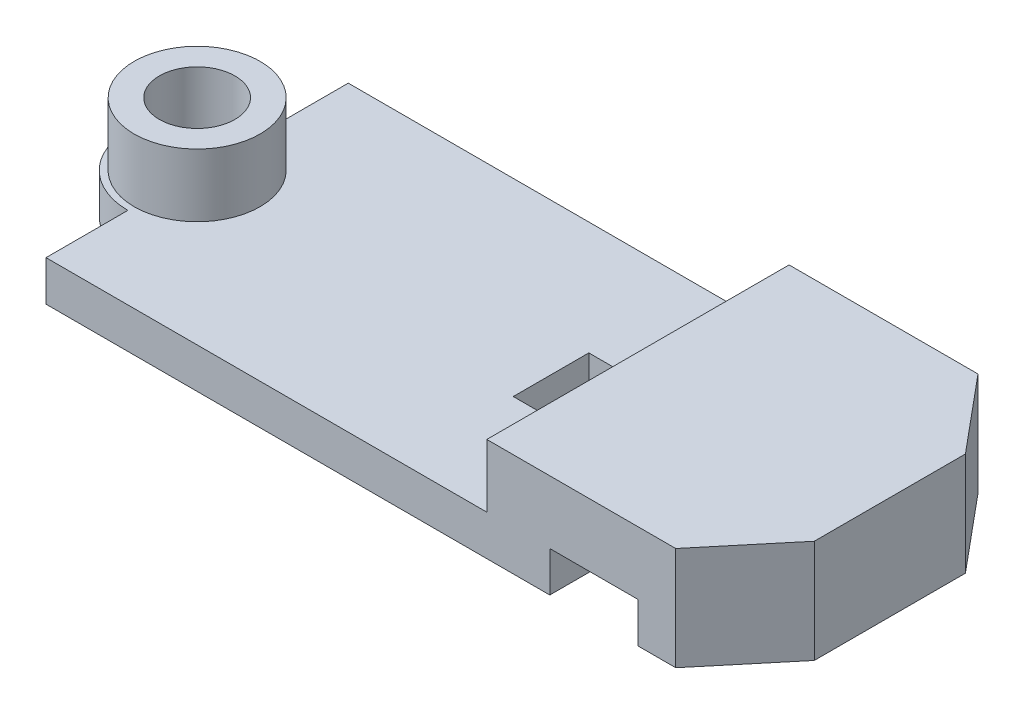
ISO-10303-21;
HEADER;
FILE_DESCRIPTION(('STEP AP214'),'2;1');
FILE_NAME('part.step','',(''),(''),'','','');
FILE_SCHEMA(('AUTOMOTIVE_DESIGN { 1 0 10303 214 1 1 1 1 }'));
ENDSEC;
DATA;
#1=APPLICATION_CONTEXT('core data for automotive mechanical design processes');
#2=APPLICATION_PROTOCOL_DEFINITION('international standard','automotive_design',2000,#1);
#3=PRODUCT_CONTEXT('',#1,'mechanical');
#4=PRODUCT('Part','Part','',(#3));
#5=PRODUCT_RELATED_PRODUCT_CATEGORY('part','',(#4));
#6=PRODUCT_DEFINITION_FORMATION('','',#4);
#7=PRODUCT_DEFINITION_CONTEXT('part definition',#1,'design');
#8=PRODUCT_DEFINITION('design','',#6,#7);
#9=PRODUCT_DEFINITION_SHAPE('','',#8);
#10=(LENGTH_UNIT() NAMED_UNIT(*) SI_UNIT(.MILLI.,.METRE.));
#11=(NAMED_UNIT(*) PLANE_ANGLE_UNIT() SI_UNIT($,.RADIAN.));
#12=(NAMED_UNIT(*) SI_UNIT($,.STERADIAN.) SOLID_ANGLE_UNIT());
#13=UNCERTAINTY_MEASURE_WITH_UNIT(LENGTH_MEASURE(1.E-05),#10,'distance_accuracy_value','');
#14=(GEOMETRIC_REPRESENTATION_CONTEXT(3) GLOBAL_UNCERTAINTY_ASSIGNED_CONTEXT((#13)) GLOBAL_UNIT_ASSIGNED_CONTEXT((#10,
#11,#12)) REPRESENTATION_CONTEXT('',''));
#15=CARTESIAN_POINT('',(0.,0.,0.));
#16=DIRECTION('',(0.,0.,1.));
#17=DIRECTION('',(1.,0.,0.));
#18=AXIS2_PLACEMENT_3D('',#15,#16,#17);
#19=CARTESIAN_POINT('',(0.,0.,0.));
#20=DIRECTION('',(0.,1.,0.));
#21=DIRECTION('',(0.,0.,1.));
#22=AXIS2_PLACEMENT_3D('',#19,#20,#21);
#23=PLANE('',#22);
#24=DIRECTION('',(1.,0.,0.));
#25=VECTOR('',#24,1.);
#26=CARTESIAN_POINT('',(53.,0.,-15.));
#27=LINE('',#26,#25);
#28=CARTESIAN_POINT('',(53.,0.,-15.));
#29=VERTEX_POINT('',#28);
#30=CARTESIAN_POINT('',(78.,0.,-15.));
#31=VERTEX_POINT('',#30);
#32=EDGE_CURVE('E249',#29,#31,#27,.T.);
#33=ORIENTED_EDGE('',*,*,#32,.F.);
#34=DIRECTION('',(0.,0.,1.));
#35=VECTOR('',#34,1.);
#36=CARTESIAN_POINT('',(53.,0.,-15.));
#37=LINE('',#36,#35);
#38=CARTESIAN_POINT('',(53.,0.,15.));
#39=VERTEX_POINT('',#38);
#40=EDGE_CURVE('E240',#29,#39,#37,.T.);
#41=ORIENTED_EDGE('',*,*,#40,.T.);
#42=DIRECTION('',(1.,0.,0.));
#43=VECTOR('',#42,1.);
#44=CARTESIAN_POINT('',(53.,0.,15.));
#45=LINE('',#44,#43);
#46=CARTESIAN_POINT('',(78.,0.,15.));
#47=VERTEX_POINT('',#46);
#48=EDGE_CURVE('E243',#39,#47,#45,.T.);
#49=ORIENTED_EDGE('',*,*,#48,.T.);
#50=DIRECTION('',(0.,0.,1.));
#51=VECTOR('',#50,1.);
#52=CARTESIAN_POINT('',(78.,0.,-15.));
#53=LINE('',#52,#51);
#54=EDGE_CURVE('E247',#31,#47,#53,.T.);
#55=ORIENTED_EDGE('',*,*,#54,.F.);
#56=EDGE_LOOP('',(#33,#41,#49,#55));
#57=FACE_BOUND('',#56,.T.);
#58=CARTESIAN_POINT('',(-87.5,0.,0.));
#59=DIRECTION('',(0.,-1.,0.));
#60=DIRECTION('',(0.,0.,-1.));
#61=AXIS2_PLACEMENT_3D('',#58,#59,#60);
#62=CIRCLE('',#61,30.);
#63=CARTESIAN_POINT('',(-87.5,0.,-30.));
#64=VERTEX_POINT('',#63);
#65=CARTESIAN_POINT('',(-87.5,0.,30.));
#66=VERTEX_POINT('',#65);
#67=EDGE_CURVE('E209',#64,#66,#62,.T.);
#68=ORIENTED_EDGE('',*,*,#67,.F.);
#69=DIRECTION('',(0.,0.,1.));
#70=VECTOR('',#69,1.);
#71=CARTESIAN_POINT('',(-87.5,0.,-60.));
#72=LINE('',#71,#70);
#73=CARTESIAN_POINT('',(-87.5,0.,-60.));
#74=VERTEX_POINT('',#73);
#75=EDGE_CURVE('E351',#74,#64,#72,.T.);
#76=ORIENTED_EDGE('',*,*,#75,.F.);
#77=DIRECTION('',(-1.,0.,0.));
#78=VECTOR('',#77,1.);
#79=CARTESIAN_POINT('',(-87.5,0.,-60.));
#80=LINE('',#79,#78);
#81=CARTESIAN_POINT('',(112.5,0.,-60.));
#82=VERTEX_POINT('',#81);
#83=EDGE_CURVE('E322',#82,#74,#80,.T.);
#84=ORIENTED_EDGE('',*,*,#83,.F.);
#85=DIRECTION('',(0.,0.,1.));
#86=VECTOR('',#85,1.);
#87=CARTESIAN_POINT('',(112.5,0.,-60.));
#88=LINE('',#87,#86);
#89=CARTESIAN_POINT('',(112.5,0.,60.));
#90=VERTEX_POINT('',#89);
#91=EDGE_CURVE('E289',#82,#90,#88,.T.);
#92=ORIENTED_EDGE('',*,*,#91,.T.);
#93=DIRECTION('',(1.,0.,0.));
#94=VECTOR('',#93,1.);
#95=CARTESIAN_POINT('',(-87.5,0.,60.));
#96=LINE('',#95,#94);
#97=CARTESIAN_POINT('',(-87.5,0.,60.));
#98=VERTEX_POINT('',#97);
#99=EDGE_CURVE('E338',#98,#90,#96,.T.);
#100=ORIENTED_EDGE('',*,*,#99,.F.);
#101=EDGE_CURVE('E350',#66,#98,#72,.T.);
#102=ORIENTED_EDGE('',*,*,#101,.F.);
#103=EDGE_LOOP('',(#68,#76,#84,#92,#100,#102));
#104=FACE_BOUND('',#103,.T.);
#105=ADVANCED_FACE('F36',(#57,#104),#23,.F.);
#106=DIRECTION('',(0.,0.,-1.));
#107=VECTOR('',#106,1.);
#108=CARTESIAN_POINT('',(-87.5,0.,30.));
#109=LINE('',#108,#107);
#110=CARTESIAN_POINT('',(-87.5,0.,27.5));
#111=VERTEX_POINT('',#110);
#112=CARTESIAN_POINT('',(-87.5,0.,25.));
#113=VERTEX_POINT('',#112);
#114=EDGE_CURVE('E205',#111,#113,#109,.T.);
#115=ORIENTED_EDGE('',*,*,#114,.F.);
#116=CARTESIAN_POINT('',(-87.5,0.,0.));
#117=DIRECTION('',(0.,-1.,0.));
#118=DIRECTION('',(0.,0.,-1.));
#119=AXIS2_PLACEMENT_3D('',#116,#117,#118);
#120=CIRCLE('',#119,27.5);
#121=CARTESIAN_POINT('',(-87.5,0.,-27.5));
#122=VERTEX_POINT('',#121);
#123=EDGE_CURVE('E223',#111,#122,#120,.T.);
#124=ORIENTED_EDGE('',*,*,#123,.T.);
#125=CARTESIAN_POINT('',(-87.5,0.,-25.));
#126=VERTEX_POINT('',#125);
#127=EDGE_CURVE('E408',#126,#122,#109,.T.);
#128=ORIENTED_EDGE('',*,*,#127,.F.);
#129=CARTESIAN_POINT('',(-87.5,0.,0.));
#130=DIRECTION('',(0.,-1.,0.));
#131=DIRECTION('',(0.,0.,-1.));
#132=AXIS2_PLACEMENT_3D('',#129,#130,#131);
#133=CIRCLE('',#132,25.);
#134=EDGE_CURVE('E211',#113,#126,#133,.T.);
#135=ORIENTED_EDGE('',*,*,#134,.F.);
#136=EDGE_LOOP('',(#115,#124,#128,#135));
#137=FACE_BOUND('',#136,.T.);
#138=ADVANCED_FACE('F407',(#137),#23,.F.);
#139=CARTESIAN_POINT('',(-87.5,16.,-60.));
#140=DIRECTION('',(1.,0.,0.));
#141=DIRECTION('',(0.,0.,-1.));
#142=AXIS2_PLACEMENT_3D('',#139,#140,#141);
#143=PLANE('',#142);
#144=DIRECTION('',(0.,0.,1.));
#145=VECTOR('',#144,1.);
#146=CARTESIAN_POINT('',(-87.5,16.,-60.));
#147=LINE('',#146,#145);
#148=CARTESIAN_POINT('',(-87.5,16.,27.5));
#149=VERTEX_POINT('',#148);
#150=CARTESIAN_POINT('',(-87.5,16.,60.));
#151=VERTEX_POINT('',#150);
#152=EDGE_CURVE('E340',#149,#151,#147,.T.);
#153=ORIENTED_EDGE('',*,*,#152,.F.);
#154=DIRECTION('',(0.,-1.,0.));
#155=VECTOR('',#154,1.);
#156=CARTESIAN_POINT('',(-87.5,16.,27.5));
#157=LINE('',#156,#155);
#158=EDGE_CURVE('E231',#149,#111,#157,.T.);
#159=ORIENTED_EDGE('',*,*,#158,.T.);
#160=ORIENTED_EDGE('',*,*,#114,.T.);
#161=DIRECTION('',(0.,1.,0.));
#162=VECTOR('',#161,1.);
#163=CARTESIAN_POINT('',(-87.5,-30.,25.));
#164=LINE('',#163,#162);
#165=CARTESIAN_POINT('',(-87.5,-30.,25.));
#166=VERTEX_POINT('',#165);
#167=EDGE_CURVE('E193',#166,#113,#164,.T.);
#168=ORIENTED_EDGE('',*,*,#167,.F.);
#169=DIRECTION('',(0.,0.,-1.));
#170=VECTOR('',#169,1.);
#171=CARTESIAN_POINT('',(-87.5,-30.,30.));
#172=LINE('',#171,#170);
#173=CARTESIAN_POINT('',(-87.5,-30.,30.));
#174=VERTEX_POINT('',#173);
#175=EDGE_CURVE('E185',#174,#166,#172,.T.);
#176=ORIENTED_EDGE('',*,*,#175,.F.);
#177=DIRECTION('',(0.,1.,0.));
#178=VECTOR('',#177,1.);
#179=CARTESIAN_POINT('',(-87.5,-30.,30.));
#180=LINE('',#179,#178);
#181=EDGE_CURVE('E190',#174,#66,#180,.T.);
#182=ORIENTED_EDGE('',*,*,#181,.T.);
#183=ORIENTED_EDGE('',*,*,#101,.T.);
#184=DIRECTION('',(0.,-1.,0.));
#185=VECTOR('',#184,1.);
#186=CARTESIAN_POINT('',(-87.5,16.,60.));
#187=LINE('',#186,#185);
#188=EDGE_CURVE('E44',#151,#98,#187,.T.);
#189=ORIENTED_EDGE('',*,*,#188,.F.);
#190=EDGE_LOOP('',(#153,#159,#160,#168,#176,#182,#183,#189));
#191=FACE_BOUND('',#190,.T.);
#192=ADVANCED_FACE('F188',(#191),#143,.F.);
#193=CARTESIAN_POINT('',(-87.5,16.,-60.));
#194=DIRECTION('',(0.,0.,1.));
#195=DIRECTION('',(1.,0.,0.));
#196=AXIS2_PLACEMENT_3D('',#193,#194,#195);
#197=PLANE('',#196);
#198=DIRECTION('',(0.,1.,0.));
#199=VECTOR('',#198,1.);
#200=CARTESIAN_POINT('',(112.5,0.,-60.));
#201=LINE('',#200,#199);
#202=CARTESIAN_POINT('',(112.5,16.,-60.));
#203=VERTEX_POINT('',#202);
#204=EDGE_CURVE('E267',#82,#203,#201,.T.);
#205=ORIENTED_EDGE('',*,*,#204,.F.);
#206=ORIENTED_EDGE('',*,*,#83,.T.);
#207=DIRECTION('',(0.,-1.,0.));
#208=VECTOR('',#207,1.);
#209=CARTESIAN_POINT('',(-87.5,16.,-60.));
#210=LINE('',#209,#208);
#211=CARTESIAN_POINT('',(-87.5,16.,-60.));
#212=VERTEX_POINT('',#211);
#213=EDGE_CURVE('E11',#212,#74,#210,.T.);
#214=ORIENTED_EDGE('',*,*,#213,.F.);
#215=DIRECTION('',(-1.,0.,0.));
#216=VECTOR('',#215,1.);
#217=CARTESIAN_POINT('',(-87.5,16.,-60.));
#218=LINE('',#217,#216);
#219=CARTESIAN_POINT('',(87.5,16.,-60.));
#220=VERTEX_POINT('',#219);
#221=EDGE_CURVE('E337',#220,#212,#218,.T.);
#222=ORIENTED_EDGE('',*,*,#221,.F.);
#223=DIRECTION('',(0.,-1.,0.));
#224=VECTOR('',#223,1.);
#225=CARTESIAN_POINT('',(87.5,41.,-60.));
#226=LINE('',#225,#224);
#227=CARTESIAN_POINT('',(87.5,41.,-60.));
#228=VERTEX_POINT('',#227);
#229=EDGE_CURVE('E311',#228,#220,#226,.T.);
#230=ORIENTED_EDGE('',*,*,#229,.F.);
#231=DIRECTION('',(1.,0.,0.));
#232=VECTOR('',#231,1.);
#233=CARTESIAN_POINT('',(87.5,41.,-60.));
#234=LINE('',#233,#232);
#235=CARTESIAN_POINT('',(162.5,41.,-60.));
#236=VERTEX_POINT('',#235);
#237=EDGE_CURVE('E296',#228,#236,#234,.T.);
#238=ORIENTED_EDGE('',*,*,#237,.T.);
#239=DIRECTION('',(0.,-1.,0.));
#240=VECTOR('',#239,1.);
#241=CARTESIAN_POINT('',(162.5,41.,-60.));
#242=LINE('',#241,#240);
#243=CARTESIAN_POINT('',(162.5,0.,-60.));
#244=VERTEX_POINT('',#243);
#245=EDGE_CURVE('E330',#236,#244,#242,.T.);
#246=ORIENTED_EDGE('',*,*,#245,.T.);
#247=CARTESIAN_POINT('',(147.5,0.,-60.));
#248=VERTEX_POINT('',#247);
#249=EDGE_CURVE('E347',#244,#248,#80,.T.);
#250=ORIENTED_EDGE('',*,*,#249,.T.);
#251=DIRECTION('',(0.,1.,0.));
#252=VECTOR('',#251,1.);
#253=CARTESIAN_POINT('',(147.5,0.,-60.));
#254=LINE('',#253,#252);
#255=CARTESIAN_POINT('',(147.5,16.,-60.));
#256=VERTEX_POINT('',#255);
#257=EDGE_CURVE('E273',#248,#256,#254,.T.);
#258=ORIENTED_EDGE('',*,*,#257,.T.);
#259=DIRECTION('',(-1.,0.,0.));
#260=VECTOR('',#259,1.);
#261=CARTESIAN_POINT('',(147.5,16.,-60.));
#262=LINE('',#261,#260);
#263=EDGE_CURVE('E269',#256,#203,#262,.T.);
#264=ORIENTED_EDGE('',*,*,#263,.T.);
#265=EDGE_LOOP('',(#205,#206,#214,#222,#230,#238,#246,#250,#258,#264));
#266=FACE_BOUND('',#265,.T.);
#267=ADVANCED_FACE('F38',(#266),#197,.F.);
#268=CARTESIAN_POINT('',(-87.5,16.,60.));
#269=DIRECTION('',(0.,0.,-1.));
#270=DIRECTION('',(-1.,0.,0.));
#271=AXIS2_PLACEMENT_3D('',#268,#269,#270);
#272=PLANE('',#271);
#273=DIRECTION('',(0.,1.,0.));
#274=VECTOR('',#273,1.);
#275=CARTESIAN_POINT('',(112.5,0.,60.));
#276=LINE('',#275,#274);
#277=CARTESIAN_POINT('',(112.5,16.,60.));
#278=VERTEX_POINT('',#277);
#279=EDGE_CURVE('E262',#90,#278,#276,.T.);
#280=ORIENTED_EDGE('',*,*,#279,.T.);
#281=DIRECTION('',(-1.,0.,0.));
#282=VECTOR('',#281,1.);
#283=CARTESIAN_POINT('',(147.5,16.,60.));
#284=LINE('',#283,#282);
#285=CARTESIAN_POINT('',(147.5,16.,60.));
#286=VERTEX_POINT('',#285);
#287=EDGE_CURVE('E279',#286,#278,#284,.T.);
#288=ORIENTED_EDGE('',*,*,#287,.F.);
#289=DIRECTION('',(0.,1.,0.));
#290=VECTOR('',#289,1.);
#291=CARTESIAN_POINT('',(147.5,0.,60.));
#292=LINE('',#291,#290);
#293=CARTESIAN_POINT('',(147.5,0.,60.));
#294=VERTEX_POINT('',#293);
#295=EDGE_CURVE('E270',#294,#286,#292,.T.);
#296=ORIENTED_EDGE('',*,*,#295,.F.);
#297=CARTESIAN_POINT('',(162.5,0.,60.));
#298=VERTEX_POINT('',#297);
#299=EDGE_CURVE('E354',#294,#298,#96,.T.);
#300=ORIENTED_EDGE('',*,*,#299,.T.);
#301=DIRECTION('',(0.,-1.,0.));
#302=VECTOR('',#301,1.);
#303=CARTESIAN_POINT('',(162.5,41.,60.));
#304=LINE('',#303,#302);
#305=CARTESIAN_POINT('',(162.5,41.,60.));
#306=VERTEX_POINT('',#305);
#307=EDGE_CURVE('E323',#306,#298,#304,.T.);
#308=ORIENTED_EDGE('',*,*,#307,.F.);
#309=DIRECTION('',(1.,0.,0.));
#310=VECTOR('',#309,1.);
#311=CARTESIAN_POINT('',(87.5,41.,60.));
#312=LINE('',#311,#310);
#313=CARTESIAN_POINT('',(87.5,41.,60.));
#314=VERTEX_POINT('',#313);
#315=EDGE_CURVE('E309',#314,#306,#312,.T.);
#316=ORIENTED_EDGE('',*,*,#315,.F.);
#317=DIRECTION('',(0.,-1.,0.));
#318=VECTOR('',#317,1.);
#319=CARTESIAN_POINT('',(87.5,41.,60.));
#320=LINE('',#319,#318);
#321=CARTESIAN_POINT('',(87.5,16.,60.));
#322=VERTEX_POINT('',#321);
#323=EDGE_CURVE('E319',#314,#322,#320,.T.);
#324=ORIENTED_EDGE('',*,*,#323,.T.);
#325=DIRECTION('',(1.,0.,0.));
#326=VECTOR('',#325,1.);
#327=CARTESIAN_POINT('',(-87.5,16.,60.));
#328=LINE('',#327,#326);
#329=EDGE_CURVE('E344',#151,#322,#328,.T.);
#330=ORIENTED_EDGE('',*,*,#329,.F.);
#331=ORIENTED_EDGE('',*,*,#188,.T.);
#332=ORIENTED_EDGE('',*,*,#99,.T.);
#333=EDGE_LOOP('',(#280,#288,#296,#300,#308,#316,#324,#330,#331,#332));
#334=FACE_BOUND('',#333,.T.);
#335=ADVANCED_FACE('F361',(#334),#272,.F.);
#336=ORIENTED_EDGE('',*,*,#75,.T.);
#337=DIRECTION('',(0.,1.,0.));
#338=VECTOR('',#337,1.);
#339=CARTESIAN_POINT('',(-87.5,-30.,-30.));
#340=LINE('',#339,#338);
#341=CARTESIAN_POINT('',(-87.5,-30.,-30.));
#342=VERTEX_POINT('',#341);
#343=EDGE_CURVE('E197',#342,#64,#340,.T.);
#344=ORIENTED_EDGE('',*,*,#343,.F.);
#345=CARTESIAN_POINT('',(-87.5,-30.,-25.));
#346=VERTEX_POINT('',#345);
#347=EDGE_CURVE('E198',#346,#342,#172,.T.);
#348=ORIENTED_EDGE('',*,*,#347,.F.);
#349=DIRECTION('',(0.,1.,0.));
#350=VECTOR('',#349,1.);
#351=CARTESIAN_POINT('',(-87.5,-30.,-25.));
#352=LINE('',#351,#350);
#353=EDGE_CURVE('E221',#346,#126,#352,.T.);
#354=ORIENTED_EDGE('',*,*,#353,.T.);
#355=ORIENTED_EDGE('',*,*,#127,.T.);
#356=DIRECTION('',(0.,-1.,0.));
#357=VECTOR('',#356,1.);
#358=CARTESIAN_POINT('',(-87.5,16.,-27.5));
#359=LINE('',#358,#357);
#360=CARTESIAN_POINT('',(-87.5,16.,-27.5));
#361=VERTEX_POINT('',#360);
#362=EDGE_CURVE('E226',#122,#361,#359,.F.);
#363=ORIENTED_EDGE('',*,*,#362,.T.);
#364=EDGE_CURVE('E341',#212,#361,#147,.T.);
#365=ORIENTED_EDGE('',*,*,#364,.F.);
#366=ORIENTED_EDGE('',*,*,#213,.T.);
#367=EDGE_LOOP('',(#336,#344,#348,#354,#355,#363,#365,#366));
#368=FACE_BOUND('',#367,.T.);
#369=ADVANCED_FACE('F439',(#368),#143,.F.);
#370=CARTESIAN_POINT('',(0.,16.,0.));
#371=DIRECTION('',(0.,1.,0.));
#372=DIRECTION('',(0.,0.,1.));
#373=AXIS2_PLACEMENT_3D('',#370,#371,#372);
#374=PLANE('',#373);
#375=CARTESIAN_POINT('',(-87.5,16.,0.));
#376=DIRECTION('',(0.,-1.,0.));
#377=DIRECTION('',(0.,0.,-1.));
#378=AXIS2_PLACEMENT_3D('',#375,#376,#377);
#379=CIRCLE('',#378,27.5);
#380=EDGE_CURVE('E224',#149,#361,#379,.T.);
#381=ORIENTED_EDGE('',*,*,#380,.F.);
#382=ORIENTED_EDGE('',*,*,#152,.T.);
#383=ORIENTED_EDGE('',*,*,#329,.T.);
#384=DIRECTION('',(0.,0.,-1.));
#385=VECTOR('',#384,1.);
#386=CARTESIAN_POINT('',(87.5,16.,-60.));
#387=LINE('',#386,#385);
#388=EDGE_CURVE('E334',#322,#220,#387,.T.);
#389=ORIENTED_EDGE('',*,*,#388,.T.);
#390=ORIENTED_EDGE('',*,*,#221,.T.);
#391=ORIENTED_EDGE('',*,*,#364,.T.);
#392=EDGE_LOOP('',(#381,#382,#383,#389,#390,#391));
#393=FACE_BOUND('',#392,.T.);
#394=CARTESIAN_POINT('',(-87.5,16.,0.));
#395=DIRECTION('',(0.,1.,0.));
#396=DIRECTION('',(0.,0.,1.));
#397=AXIS2_PLACEMENT_3D('',#394,#395,#396);
#398=CIRCLE('',#397,25.);
#399=CARTESIAN_POINT('',(-87.5,16.,25.));
#400=VERTEX_POINT('',#399);
#401=EDGE_CURVE('E234',#400,#400,#398,.T.);
#402=ORIENTED_EDGE('',*,*,#401,.F.);
#403=EDGE_LOOP('',(#402));
#404=FACE_BOUND('',#403,.T.);
#405=DIRECTION('',(0.,0.,1.));
#406=VECTOR('',#405,1.);
#407=CARTESIAN_POINT('',(53.,16.,-15.));
#408=LINE('',#407,#406);
#409=CARTESIAN_POINT('',(53.,16.,-15.));
#410=VERTEX_POINT('',#409);
#411=CARTESIAN_POINT('',(53.,16.,15.));
#412=VERTEX_POINT('',#411);
#413=EDGE_CURVE('E59',#410,#412,#408,.T.);
#414=ORIENTED_EDGE('',*,*,#413,.F.);
#415=DIRECTION('',(1.,0.,0.));
#416=VECTOR('',#415,1.);
#417=CARTESIAN_POINT('',(53.,16.,-15.));
#418=LINE('',#417,#416);
#419=CARTESIAN_POINT('',(78.,16.,-15.));
#420=VERTEX_POINT('',#419);
#421=EDGE_CURVE('E244',#410,#420,#418,.T.);
#422=ORIENTED_EDGE('',*,*,#421,.T.);
#423=DIRECTION('',(0.,0.,1.));
#424=VECTOR('',#423,1.);
#425=CARTESIAN_POINT('',(78.,16.,-15.));
#426=LINE('',#425,#424);
#427=CARTESIAN_POINT('',(78.,16.,15.));
#428=VERTEX_POINT('',#427);
#429=EDGE_CURVE('E255',#420,#428,#426,.T.);
#430=ORIENTED_EDGE('',*,*,#429,.T.);
#431=DIRECTION('',(1.,0.,0.));
#432=VECTOR('',#431,1.);
#433=CARTESIAN_POINT('',(53.,16.,15.));
#434=LINE('',#433,#432);
#435=EDGE_CURVE('E253',#412,#428,#434,.T.);
#436=ORIENTED_EDGE('',*,*,#435,.F.);
#437=EDGE_LOOP('',(#414,#422,#430,#436));
#438=FACE_BOUND('',#437,.T.);
#439=ADVANCED_FACE('F398',(#393,#404,#438),#374,.T.);
#440=ORIENTED_EDGE('',*,*,#299,.F.);
#441=DIRECTION('',(0.,0.,1.));
#442=VECTOR('',#441,1.);
#443=CARTESIAN_POINT('',(147.5,0.,-60.));
#444=LINE('',#443,#442);
#445=EDGE_CURVE('E276',#248,#294,#444,.T.);
#446=ORIENTED_EDGE('',*,*,#445,.F.);
#447=ORIENTED_EDGE('',*,*,#249,.F.);
#448=DIRECTION('',(0.640184399664479,0.,0.768221279597376));
#449=VECTOR('',#448,1.);
#450=CARTESIAN_POINT('',(162.5,0.,-60.));
#451=LINE('',#450,#449);
#452=CARTESIAN_POINT('',(187.5,0.,-30.));
#453=VERTEX_POINT('',#452);
#454=EDGE_CURVE('E292',#244,#453,#451,.T.);
#455=ORIENTED_EDGE('',*,*,#454,.T.);
#456=DIRECTION('',(0.,0.,1.));
#457=VECTOR('',#456,1.);
#458=CARTESIAN_POINT('',(187.5,0.,-30.));
#459=LINE('',#458,#457);
#460=CARTESIAN_POINT('',(187.5,0.,30.));
#461=VERTEX_POINT('',#460);
#462=EDGE_CURVE('E314',#453,#461,#459,.T.);
#463=ORIENTED_EDGE('',*,*,#462,.T.);
#464=DIRECTION('',(-0.64018439966448,0.,0.768221279597376));
#465=VECTOR('',#464,1.);
#466=CARTESIAN_POINT('',(187.5,0.,30.));
#467=LINE('',#466,#465);
#468=EDGE_CURVE('E297',#461,#298,#467,.T.);
#469=ORIENTED_EDGE('',*,*,#468,.T.);
#470=EDGE_LOOP('',(#440,#446,#447,#455,#463,#469));
#471=FACE_BOUND('',#470,.T.);
#472=ADVANCED_FACE('F381',(#471),#23,.F.);
#473=CARTESIAN_POINT('',(87.5,41.,60.));
#474=DIRECTION('',(-1.,0.,0.));
#475=DIRECTION('',(0.,0.,1.));
#476=AXIS2_PLACEMENT_3D('',#473,#474,#475);
#477=PLANE('',#476);
#478=ORIENTED_EDGE('',*,*,#388,.F.);
#479=ORIENTED_EDGE('',*,*,#323,.F.);
#480=DIRECTION('',(0.,0.,-1.));
#481=VECTOR('',#480,1.);
#482=CARTESIAN_POINT('',(87.5,41.,60.));
#483=LINE('',#482,#481);
#484=EDGE_CURVE('E293',#314,#228,#483,.T.);
#485=ORIENTED_EDGE('',*,*,#484,.T.);
#486=ORIENTED_EDGE('',*,*,#229,.T.);
#487=EDGE_LOOP('',(#478,#479,#485,#486));
#488=FACE_BOUND('',#487,.T.);
#489=ADVANCED_FACE('F394',(#488),#477,.T.);
#490=CARTESIAN_POINT('',(187.5,41.,30.));
#491=DIRECTION('',(0.768221279597376,0.,0.64018439966448));
#492=DIRECTION('',(0.64018439966448,0.,-0.768221279597376));
#493=AXIS2_PLACEMENT_3D('',#490,#491,#492);
#494=PLANE('',#493);
#495=ORIENTED_EDGE('',*,*,#468,.F.);
#496=DIRECTION('',(0.,-1.,0.));
#497=VECTOR('',#496,1.);
#498=CARTESIAN_POINT('',(187.5,41.,30.));
#499=LINE('',#498,#497);
#500=CARTESIAN_POINT('',(187.5,41.,30.));
#501=VERTEX_POINT('',#500);
#502=EDGE_CURVE('E326',#501,#461,#499,.T.);
#503=ORIENTED_EDGE('',*,*,#502,.F.);
#504=DIRECTION('',(-0.64018439966448,0.,0.768221279597376));
#505=VECTOR('',#504,1.);
#506=CARTESIAN_POINT('',(187.5,41.,30.));
#507=LINE('',#506,#505);
#508=EDGE_CURVE('E306',#501,#306,#507,.T.);
#509=ORIENTED_EDGE('',*,*,#508,.T.);
#510=ORIENTED_EDGE('',*,*,#307,.T.);
#511=EDGE_LOOP('',(#495,#503,#509,#510));
#512=FACE_BOUND('',#511,.T.);
#513=ADVANCED_FACE('F385',(#512),#494,.T.);
#514=CARTESIAN_POINT('',(187.5,41.,-30.));
#515=DIRECTION('',(1.,0.,0.));
#516=DIRECTION('',(0.,0.,-1.));
#517=AXIS2_PLACEMENT_3D('',#514,#515,#516);
#518=PLANE('',#517);
#519=ORIENTED_EDGE('',*,*,#462,.F.);
#520=DIRECTION('',(0.,-1.,0.));
#521=VECTOR('',#520,1.);
#522=CARTESIAN_POINT('',(187.5,41.,-30.));
#523=LINE('',#522,#521);
#524=CARTESIAN_POINT('',(187.5,41.,-30.));
#525=VERTEX_POINT('',#524);
#526=EDGE_CURVE('E328',#525,#453,#523,.T.);
#527=ORIENTED_EDGE('',*,*,#526,.F.);
#528=DIRECTION('',(0.,0.,1.));
#529=VECTOR('',#528,1.);
#530=CARTESIAN_POINT('',(187.5,41.,-30.));
#531=LINE('',#530,#529);
#532=EDGE_CURVE('E303',#525,#501,#531,.T.);
#533=ORIENTED_EDGE('',*,*,#532,.T.);
#534=ORIENTED_EDGE('',*,*,#502,.T.);
#535=EDGE_LOOP('',(#519,#527,#533,#534));
#536=FACE_BOUND('',#535,.T.);
#537=ADVANCED_FACE('F476',(#536),#518,.T.);
#538=CARTESIAN_POINT('',(162.5,41.,-60.));
#539=DIRECTION('',(0.768221279597376,0.,-0.640184399664479));
#540=DIRECTION('',(-0.640184399664479,0.,-0.768221279597376));
#541=AXIS2_PLACEMENT_3D('',#538,#539,#540);
#542=PLANE('',#541);
#543=ORIENTED_EDGE('',*,*,#454,.F.);
#544=ORIENTED_EDGE('',*,*,#245,.F.);
#545=DIRECTION('',(0.640184399664479,0.,0.768221279597376));
#546=VECTOR('',#545,1.);
#547=CARTESIAN_POINT('',(162.5,41.,-60.));
#548=LINE('',#547,#546);
#549=EDGE_CURVE('E300',#236,#525,#548,.T.);
#550=ORIENTED_EDGE('',*,*,#549,.T.);
#551=ORIENTED_EDGE('',*,*,#526,.T.);
#552=EDGE_LOOP('',(#543,#544,#550,#551));
#553=FACE_BOUND('',#552,.T.);
#554=ADVANCED_FACE('F479',(#553),#542,.T.);
#555=CARTESIAN_POINT('',(0.,41.,0.));
#556=DIRECTION('',(0.,-1.,0.));
#557=DIRECTION('',(0.,0.,-1.));
#558=AXIS2_PLACEMENT_3D('',#555,#556,#557);
#559=PLANE('',#558);
#560=ORIENTED_EDGE('',*,*,#484,.F.);
#561=ORIENTED_EDGE('',*,*,#315,.T.);
#562=ORIENTED_EDGE('',*,*,#508,.F.);
#563=ORIENTED_EDGE('',*,*,#532,.F.);
#564=ORIENTED_EDGE('',*,*,#549,.F.);
#565=ORIENTED_EDGE('',*,*,#237,.F.);
#566=EDGE_LOOP('',(#560,#561,#562,#563,#564,#565));
#567=FACE_BOUND('',#566,.T.);
#568=ADVANCED_FACE('F391',(#567),#559,.F.);
#569=CARTESIAN_POINT('',(112.5,0.,-60.));
#570=DIRECTION('',(1.,0.,0.));
#571=DIRECTION('',(0.,0.,-1.));
#572=AXIS2_PLACEMENT_3D('',#569,#570,#571);
#573=PLANE('',#572);
#574=ORIENTED_EDGE('',*,*,#279,.F.);
#575=ORIENTED_EDGE('',*,*,#91,.F.);
#576=ORIENTED_EDGE('',*,*,#204,.T.);
#577=DIRECTION('',(0.,0.,1.));
#578=VECTOR('',#577,1.);
#579=CARTESIAN_POINT('',(112.5,16.,-60.));
#580=LINE('',#579,#578);
#581=EDGE_CURVE('E287',#203,#278,#580,.T.);
#582=ORIENTED_EDGE('',*,*,#581,.T.);
#583=EDGE_LOOP('',(#574,#575,#576,#582));
#584=FACE_BOUND('',#583,.T.);
#585=ADVANCED_FACE('F367',(#584),#573,.T.);
#586=CARTESIAN_POINT('',(147.5,16.,-60.));
#587=DIRECTION('',(0.,1.,0.));
#588=DIRECTION('',(-1.,0.,0.));
#589=AXIS2_PLACEMENT_3D('',#586,#587,#588);
#590=PLANE('',#589);
#591=ORIENTED_EDGE('',*,*,#287,.T.);
#592=ORIENTED_EDGE('',*,*,#581,.F.);
#593=ORIENTED_EDGE('',*,*,#263,.F.);
#594=DIRECTION('',(0.,0.,1.));
#595=VECTOR('',#594,1.);
#596=CARTESIAN_POINT('',(147.5,16.,-60.));
#597=LINE('',#596,#595);
#598=EDGE_CURVE('E285',#256,#286,#597,.T.);
#599=ORIENTED_EDGE('',*,*,#598,.T.);
#600=EDGE_LOOP('',(#591,#592,#593,#599));
#601=FACE_BOUND('',#600,.T.);
#602=ADVANCED_FACE('F373',(#601),#590,.F.);
#603=CARTESIAN_POINT('',(147.5,0.,-60.));
#604=DIRECTION('',(1.,0.,0.));
#605=DIRECTION('',(0.,0.,-1.));
#606=AXIS2_PLACEMENT_3D('',#603,#604,#605);
#607=PLANE('',#606);
#608=ORIENTED_EDGE('',*,*,#295,.T.);
#609=ORIENTED_EDGE('',*,*,#598,.F.);
#610=ORIENTED_EDGE('',*,*,#257,.F.);
#611=ORIENTED_EDGE('',*,*,#445,.T.);
#612=EDGE_LOOP('',(#608,#609,#610,#611));
#613=FACE_BOUND('',#612,.T.);
#614=ADVANCED_FACE('F492',(#613),#607,.F.);
#615=CARTESIAN_POINT('',(53.,0.,-15.));
#616=DIRECTION('',(-1.,0.,0.));
#617=DIRECTION('',(0.,0.,1.));
#618=AXIS2_PLACEMENT_3D('',#615,#616,#617);
#619=PLANE('',#618);
#620=ORIENTED_EDGE('',*,*,#413,.T.);
#621=DIRECTION('',(0.,1.,0.));
#622=VECTOR('',#621,1.);
#623=CARTESIAN_POINT('',(53.,0.,15.));
#624=LINE('',#623,#622);
#625=EDGE_CURVE('E251',#39,#412,#624,.T.);
#626=ORIENTED_EDGE('',*,*,#625,.F.);
#627=ORIENTED_EDGE('',*,*,#40,.F.);
#628=DIRECTION('',(0.,1.,0.));
#629=VECTOR('',#628,1.);
#630=CARTESIAN_POINT('',(53.,0.,-15.));
#631=LINE('',#630,#629);
#632=EDGE_CURVE('E260',#29,#410,#631,.T.);
#633=ORIENTED_EDGE('',*,*,#632,.T.);
#634=EDGE_LOOP('',(#620,#626,#627,#633));
#635=FACE_BOUND('',#634,.T.);
#636=ADVANCED_FACE('F445',(#635),#619,.F.);
#637=CARTESIAN_POINT('',(53.,0.,-15.));
#638=DIRECTION('',(0.,0.,1.));
#639=DIRECTION('',(1.,0.,0.));
#640=AXIS2_PLACEMENT_3D('',#637,#638,#639);
#641=PLANE('',#640);
#642=ORIENTED_EDGE('',*,*,#421,.F.);
#643=ORIENTED_EDGE('',*,*,#632,.F.);
#644=ORIENTED_EDGE('',*,*,#32,.T.);
#645=DIRECTION('',(0.,1.,0.));
#646=VECTOR('',#645,1.);
#647=CARTESIAN_POINT('',(78.,0.,-15.));
#648=LINE('',#647,#646);
#649=EDGE_CURVE('E263',#31,#420,#648,.T.);
#650=ORIENTED_EDGE('',*,*,#649,.T.);
#651=EDGE_LOOP('',(#642,#643,#644,#650));
#652=FACE_BOUND('',#651,.T.);
#653=ADVANCED_FACE('F451',(#652),#641,.T.);
#654=CARTESIAN_POINT('',(78.,0.,-15.));
#655=DIRECTION('',(-1.,0.,0.));
#656=DIRECTION('',(0.,0.,1.));
#657=AXIS2_PLACEMENT_3D('',#654,#655,#656);
#658=PLANE('',#657);
#659=ORIENTED_EDGE('',*,*,#429,.F.);
#660=ORIENTED_EDGE('',*,*,#649,.F.);
#661=ORIENTED_EDGE('',*,*,#54,.T.);
#662=DIRECTION('',(0.,1.,0.));
#663=VECTOR('',#662,1.);
#664=CARTESIAN_POINT('',(78.,0.,15.));
#665=LINE('',#664,#663);
#666=EDGE_CURVE('E51',#47,#428,#665,.T.);
#667=ORIENTED_EDGE('',*,*,#666,.T.);
#668=EDGE_LOOP('',(#659,#660,#661,#667));
#669=FACE_BOUND('',#668,.T.);
#670=ADVANCED_FACE('F453',(#669),#658,.T.);
#671=CARTESIAN_POINT('',(53.,0.,15.));
#672=DIRECTION('',(0.,0.,1.));
#673=DIRECTION('',(1.,0.,0.));
#674=AXIS2_PLACEMENT_3D('',#671,#672,#673);
#675=PLANE('',#674);
#676=ORIENTED_EDGE('',*,*,#435,.T.);
#677=ORIENTED_EDGE('',*,*,#666,.F.);
#678=ORIENTED_EDGE('',*,*,#48,.F.);
#679=ORIENTED_EDGE('',*,*,#625,.T.);
#680=EDGE_LOOP('',(#676,#677,#678,#679));
#681=FACE_BOUND('',#680,.T.);
#682=ADVANCED_FACE('F434',(#681),#675,.F.);
#683=CARTESIAN_POINT('',(-87.5,41.,0.));
#684=DIRECTION('',(0.,-1.,0.));
#685=DIRECTION('',(0.,0.,-1.));
#686=AXIS2_PLACEMENT_3D('',#683,#684,#685);
#687=CYLINDRICAL_SURFACE('',#686,25.);
#688=CARTESIAN_POINT('',(-87.5,41.,0.));
#689=DIRECTION('',(0.,1.,0.));
#690=DIRECTION('',(0.,0.,1.));
#691=AXIS2_PLACEMENT_3D('',#688,#689,#690);
#692=CIRCLE('',#691,25.);
#693=CARTESIAN_POINT('',(-87.5,41.,25.));
#694=VERTEX_POINT('',#693);
#695=EDGE_CURVE('E235',#694,#694,#692,.T.);
#696=ORIENTED_EDGE('',*,*,#695,.F.);
#697=EDGE_LOOP('',(#696));
#698=FACE_BOUND('',#697,.T.);
#699=ORIENTED_EDGE('',*,*,#401,.T.);
#700=EDGE_LOOP('',(#699));
#701=FACE_BOUND('',#700,.T.);
#702=ADVANCED_FACE('F428',(#698,#701),#687,.T.);
#703=CARTESIAN_POINT('',(-87.5,41.,0.));
#704=DIRECTION('',(0.,1.,0.));
#705=DIRECTION('',(0.,0.,1.));
#706=AXIS2_PLACEMENT_3D('',#703,#704,#705);
#707=PLANE('',#706);
#708=CARTESIAN_POINT('',(-87.5,41.,0.));
#709=DIRECTION('',(0.,1.,0.));
#710=DIRECTION('',(0.,0.,1.));
#711=AXIS2_PLACEMENT_3D('',#708,#709,#710);
#712=CIRCLE('',#711,15.);
#713=CARTESIAN_POINT('',(-87.5,41.,15.));
#714=VERTEX_POINT('',#713);
#715=EDGE_CURVE('E412',#714,#714,#712,.T.);
#716=ORIENTED_EDGE('',*,*,#715,.F.);
#717=EDGE_LOOP('',(#716));
#718=FACE_BOUND('',#717,.T.);
#719=ORIENTED_EDGE('',*,*,#695,.T.);
#720=EDGE_LOOP('',(#719));
#721=FACE_BOUND('',#720,.T.);
#722=ADVANCED_FACE('F425',(#718,#721),#707,.T.);
#723=CARTESIAN_POINT('',(-87.5,16.,0.));
#724=DIRECTION('',(0.,-1.,0.));
#725=DIRECTION('',(0.,0.,-1.));
#726=AXIS2_PLACEMENT_3D('',#723,#724,#725);
#727=CYLINDRICAL_SURFACE('',#726,27.5);
#728=ORIENTED_EDGE('',*,*,#158,.F.);
#729=ORIENTED_EDGE('',*,*,#380,.T.);
#730=ORIENTED_EDGE('',*,*,#362,.F.);
#731=ORIENTED_EDGE('',*,*,#123,.F.);
#732=EDGE_LOOP('',(#728,#729,#730,#731));
#733=FACE_BOUND('',#732,.T.);
#734=ADVANCED_FACE('F403',(#733),#727,.T.);
#735=CARTESIAN_POINT('',(-87.5,-30.,0.));
#736=DIRECTION('',(0.,1.,0.));
#737=DIRECTION('',(0.,0.,1.));
#738=AXIS2_PLACEMENT_3D('',#735,#736,#737);
#739=CYLINDRICAL_SURFACE('',#738,25.);
#740=ORIENTED_EDGE('',*,*,#134,.T.);
#741=ORIENTED_EDGE('',*,*,#353,.F.);
#742=CARTESIAN_POINT('',(-87.5,-30.,0.));
#743=DIRECTION('',(0.,-1.,0.));
#744=DIRECTION('',(0.,0.,-1.));
#745=AXIS2_PLACEMENT_3D('',#742,#743,#744);
#746=CIRCLE('',#745,25.);
#747=EDGE_CURVE('E214',#166,#346,#746,.T.);
#748=ORIENTED_EDGE('',*,*,#747,.F.);
#749=ORIENTED_EDGE('',*,*,#167,.T.);
#750=EDGE_LOOP('',(#740,#741,#748,#749));
#751=FACE_BOUND('',#750,.T.);
#752=ADVANCED_FACE('F570',(#751),#739,.T.);
#753=CARTESIAN_POINT('',(-87.5,-30.,0.));
#754=DIRECTION('',(0.,-1.,0.));
#755=DIRECTION('',(0.,0.,-1.));
#756=AXIS2_PLACEMENT_3D('',#753,#754,#755);
#757=PLANE('',#756);
#758=CARTESIAN_POINT('',(-87.5,-30.,0.));
#759=DIRECTION('',(0.,1.,0.));
#760=DIRECTION('',(0.,0.,1.));
#761=AXIS2_PLACEMENT_3D('',#758,#759,#760);
#762=CIRCLE('',#761,15.);
#763=CARTESIAN_POINT('',(-87.5,-30.,15.));
#764=VERTEX_POINT('',#763);
#765=EDGE_CURVE('E410',#764,#764,#762,.T.);
#766=ORIENTED_EDGE('',*,*,#765,.T.);
#767=EDGE_LOOP('',(#766));
#768=FACE_BOUND('',#767,.T.);
#769=ORIENTED_EDGE('',*,*,#747,.T.);
#770=ORIENTED_EDGE('',*,*,#347,.T.);
#771=CARTESIAN_POINT('',(-87.5,-30.,0.));
#772=DIRECTION('',(0.,-1.,0.));
#773=DIRECTION('',(0.,0.,-1.));
#774=AXIS2_PLACEMENT_3D('',#771,#772,#773);
#775=CIRCLE('',#774,30.);
#776=EDGE_CURVE('E201',#342,#174,#775,.T.);
#777=ORIENTED_EDGE('',*,*,#776,.T.);
#778=ORIENTED_EDGE('',*,*,#175,.T.);
#779=EDGE_LOOP('',(#769,#770,#777,#778));
#780=FACE_BOUND('',#779,.T.);
#781=ADVANCED_FACE('F202',(#768,#780),#757,.T.);
#782=CARTESIAN_POINT('',(-87.5,-30.,0.));
#783=DIRECTION('',(0.,1.,0.));
#784=DIRECTION('',(0.,0.,1.));
#785=AXIS2_PLACEMENT_3D('',#782,#783,#784);
#786=CYLINDRICAL_SURFACE('',#785,30.);
#787=ORIENTED_EDGE('',*,*,#67,.T.);
#788=ORIENTED_EDGE('',*,*,#181,.F.);
#789=ORIENTED_EDGE('',*,*,#776,.F.);
#790=ORIENTED_EDGE('',*,*,#343,.T.);
#791=EDGE_LOOP('',(#787,#788,#789,#790));
#792=FACE_BOUND('',#791,.T.);
#793=ADVANCED_FACE('F207',(#792),#786,.T.);
#794=CARTESIAN_POINT('',(-87.5,-30.,0.));
#795=DIRECTION('',(0.,1.,0.));
#796=DIRECTION('',(0.,0.,1.));
#797=AXIS2_PLACEMENT_3D('',#794,#795,#796);
#798=CYLINDRICAL_SURFACE('',#797,15.);
#799=ORIENTED_EDGE('',*,*,#765,.F.);
#800=EDGE_LOOP('',(#799));
#801=FACE_BOUND('',#800,.T.);
#802=ORIENTED_EDGE('',*,*,#715,.T.);
#803=EDGE_LOOP('',(#802));
#804=FACE_BOUND('',#803,.T.);
#805=ADVANCED_FACE('F419',(#801,#804),#798,.F.);
#806=CLOSED_SHELL('',(#105,#138,#192,#267,#335,#369,#439,#472,#489,#513,#537,#554,#568,#585,
#602,#614,#636,#653,#670,#682,#702,#722,#734,#752,#781,#793,#805));
#807=MANIFOLD_SOLID_BREP('B2',#806);
#808=ADVANCED_BREP_SHAPE_REPRESENTATION('',(#18,#807),#14);
#809=SHAPE_DEFINITION_REPRESENTATION(#9,#808);
ENDSEC;
END-ISO-10303-21;
